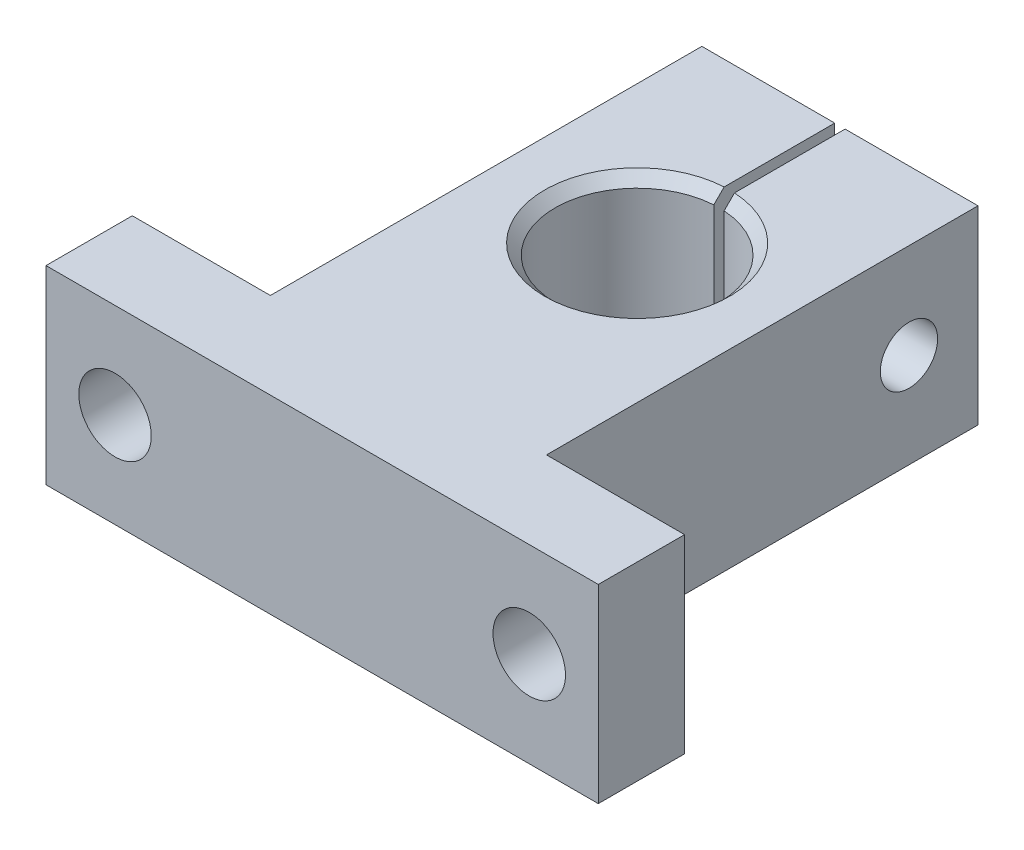
ISO-10303-21;
HEADER;
FILE_DESCRIPTION(('STEP AP214'),'2;1');
FILE_NAME('part.step','',(''),(''),'','','');
FILE_SCHEMA(('AUTOMOTIVE_DESIGN { 1 0 10303 214 1 1 1 1 }'));
ENDSEC;
DATA;
#1=APPLICATION_CONTEXT('core data for automotive mechanical design processes');
#2=APPLICATION_PROTOCOL_DEFINITION('international standard','automotive_design',2000,#1);
#3=PRODUCT_CONTEXT('',#1,'mechanical');
#4=PRODUCT('Part','Part','',(#3));
#5=PRODUCT_RELATED_PRODUCT_CATEGORY('part','',(#4));
#6=PRODUCT_DEFINITION_FORMATION('','',#4);
#7=PRODUCT_DEFINITION_CONTEXT('part definition',#1,'design');
#8=PRODUCT_DEFINITION('design','',#6,#7);
#9=PRODUCT_DEFINITION_SHAPE('','',#8);
#10=(LENGTH_UNIT() NAMED_UNIT(*) SI_UNIT(.MILLI.,.METRE.));
#11=(NAMED_UNIT(*) PLANE_ANGLE_UNIT() SI_UNIT($,.RADIAN.));
#12=(NAMED_UNIT(*) SI_UNIT($,.STERADIAN.) SOLID_ANGLE_UNIT());
#13=UNCERTAINTY_MEASURE_WITH_UNIT(LENGTH_MEASURE(1.E-05),#10,'distance_accuracy_value','');
#14=(GEOMETRIC_REPRESENTATION_CONTEXT(3) GLOBAL_UNCERTAINTY_ASSIGNED_CONTEXT((#13)) GLOBAL_UNIT_ASSIGNED_CONTEXT((#10,
#11,#12)) REPRESENTATION_CONTEXT('',''));
#15=CARTESIAN_POINT('',(0.,0.,0.));
#16=DIRECTION('',(0.,0.,1.));
#17=DIRECTION('',(1.,0.,0.));
#18=AXIS2_PLACEMENT_3D('',#15,#16,#17);
#19=CARTESIAN_POINT('',(20.32,13.97,23.1775));
#20=DIRECTION('',(0.,0.,-1.));
#21=DIRECTION('',(-1.,0.,0.));
#22=AXIS2_PLACEMENT_3D('',#19,#20,#21);
#23=PLANE('',#22);
#24=CARTESIAN_POINT('',(15.24,6.985,23.1775));
#25=DIRECTION('',(0.,0.,-1.));
#26=DIRECTION('',(-1.,0.,0.));
#27=AXIS2_PLACEMENT_3D('',#24,#25,#26);
#28=CIRCLE('',#27,2.667);
#29=CARTESIAN_POINT('',(12.573,6.985,23.1775));
#30=VERTEX_POINT('',#29);
#31=EDGE_CURVE('E337',#30,#30,#28,.T.);
#32=ORIENTED_EDGE('',*,*,#31,.T.);
#33=EDGE_LOOP('',(#32));
#34=FACE_BOUND('',#33,.T.);
#35=CARTESIAN_POINT('',(-15.24,6.985,23.1775));
#36=DIRECTION('',(0.,0.,-1.));
#37=DIRECTION('',(-1.,0.,0.));
#38=AXIS2_PLACEMENT_3D('',#35,#36,#37);
#39=CIRCLE('',#38,2.667);
#40=CARTESIAN_POINT('',(-17.907,6.985,23.1775));
#41=VERTEX_POINT('',#40);
#42=EDGE_CURVE('E431',#41,#41,#39,.T.);
#43=ORIENTED_EDGE('',*,*,#42,.T.);
#44=EDGE_LOOP('',(#43));
#45=FACE_BOUND('',#44,.T.);
#46=DIRECTION('',(1.,0.,0.));
#47=VECTOR('',#46,1.);
#48=CARTESIAN_POINT('',(20.32,0.,23.1775));
#49=LINE('',#48,#47);
#50=CARTESIAN_POINT('',(-20.32,0.,23.1775));
#51=VERTEX_POINT('',#50);
#52=CARTESIAN_POINT('',(20.32,0.,23.1775));
#53=VERTEX_POINT('',#52);
#54=EDGE_CURVE('E164',#51,#53,#49,.T.);
#55=ORIENTED_EDGE('',*,*,#54,.T.);
#56=DIRECTION('',(0.,-1.,0.));
#57=VECTOR('',#56,1.);
#58=CARTESIAN_POINT('',(20.32,13.97,23.1775));
#59=LINE('',#58,#57);
#60=CARTESIAN_POINT('',(20.32,13.97,23.1775));
#61=VERTEX_POINT('',#60);
#62=EDGE_CURVE('E145',#61,#53,#59,.T.);
#63=ORIENTED_EDGE('',*,*,#62,.F.);
#64=DIRECTION('',(1.,0.,0.));
#65=VECTOR('',#64,1.);
#66=CARTESIAN_POINT('',(20.32,13.97,23.1775));
#67=LINE('',#66,#65);
#68=CARTESIAN_POINT('',(-20.32,13.97,23.1775));
#69=VERTEX_POINT('',#68);
#70=EDGE_CURVE('E152',#69,#61,#67,.T.);
#71=ORIENTED_EDGE('',*,*,#70,.F.);
#72=DIRECTION('',(0.,-1.,0.));
#73=VECTOR('',#72,1.);
#74=CARTESIAN_POINT('',(-20.32,13.97,23.1775));
#75=LINE('',#74,#73);
#76=EDGE_CURVE('E297',#69,#51,#75,.T.);
#77=ORIENTED_EDGE('',*,*,#76,.T.);
#78=EDGE_LOOP('',(#55,#63,#71,#77));
#79=FACE_BOUND('',#78,.T.);
#80=ADVANCED_FACE('F35',(#34,#45,#79),#23,.F.);
#81=CARTESIAN_POINT('',(20.32,13.97,16.8275));
#82=DIRECTION('',(-1.,0.,0.));
#83=DIRECTION('',(0.,0.,1.));
#84=AXIS2_PLACEMENT_3D('',#81,#82,#83);
#85=PLANE('',#84);
#86=DIRECTION('',(0.,0.,-1.));
#87=VECTOR('',#86,1.);
#88=CARTESIAN_POINT('',(20.32,0.,16.8275));
#89=LINE('',#88,#87);
#90=CARTESIAN_POINT('',(20.32,0.,16.8275));
#91=VERTEX_POINT('',#90);
#92=EDGE_CURVE('E336',#53,#91,#89,.T.);
#93=ORIENTED_EDGE('',*,*,#92,.T.);
#94=DIRECTION('',(0.,-1.,0.));
#95=VECTOR('',#94,1.);
#96=CARTESIAN_POINT('',(20.32,13.97,16.8275));
#97=LINE('',#96,#95);
#98=CARTESIAN_POINT('',(20.32,13.97,16.8275));
#99=VERTEX_POINT('',#98);
#100=EDGE_CURVE('E148',#99,#91,#97,.T.);
#101=ORIENTED_EDGE('',*,*,#100,.F.);
#102=DIRECTION('',(0.,0.,-1.));
#103=VECTOR('',#102,1.);
#104=CARTESIAN_POINT('',(20.32,13.97,16.8275));
#105=LINE('',#104,#103);
#106=EDGE_CURVE('E141',#61,#99,#105,.T.);
#107=ORIENTED_EDGE('',*,*,#106,.F.);
#108=ORIENTED_EDGE('',*,*,#62,.T.);
#109=EDGE_LOOP('',(#93,#101,#107,#108));
#110=FACE_BOUND('',#109,.T.);
#111=ADVANCED_FACE('F143',(#110),#85,.F.);
#112=CARTESIAN_POINT('',(10.16,13.97,16.8275));
#113=DIRECTION('',(0.,0.,1.));
#114=DIRECTION('',(1.,0.,0.));
#115=AXIS2_PLACEMENT_3D('',#112,#113,#114);
#116=PLANE('',#115);
#117=CARTESIAN_POINT('',(15.24,6.985,16.8275));
#118=DIRECTION('',(0.,0.,1.));
#119=DIRECTION('',(1.,0.,0.));
#120=AXIS2_PLACEMENT_3D('',#117,#118,#119);
#121=CIRCLE('',#120,3.42900000000002);
#122=CARTESIAN_POINT('',(18.669,6.985,16.8275));
#123=VERTEX_POINT('',#122);
#124=EDGE_CURVE('E374',#123,#123,#121,.T.);
#125=ORIENTED_EDGE('',*,*,#124,.T.);
#126=EDGE_LOOP('',(#125));
#127=FACE_BOUND('',#126,.T.);
#128=DIRECTION('',(-1.,0.,0.));
#129=VECTOR('',#128,1.);
#130=CARTESIAN_POINT('',(10.16,0.,16.8275));
#131=LINE('',#130,#129);
#132=CARTESIAN_POINT('',(10.16,0.,16.8275));
#133=VERTEX_POINT('',#132);
#134=EDGE_CURVE('E275',#91,#133,#131,.T.);
#135=ORIENTED_EDGE('',*,*,#134,.T.);
#136=DIRECTION('',(0.,-1.,0.));
#137=VECTOR('',#136,1.);
#138=CARTESIAN_POINT('',(10.16,13.97,16.8275));
#139=LINE('',#138,#137);
#140=CARTESIAN_POINT('',(10.16,13.97,16.8275));
#141=VERTEX_POINT('',#140);
#142=EDGE_CURVE('E169',#141,#133,#139,.T.);
#143=ORIENTED_EDGE('',*,*,#142,.F.);
#144=DIRECTION('',(-1.,0.,0.));
#145=VECTOR('',#144,1.);
#146=CARTESIAN_POINT('',(10.16,13.97,16.8275));
#147=LINE('',#146,#145);
#148=EDGE_CURVE('E151',#99,#141,#147,.T.);
#149=ORIENTED_EDGE('',*,*,#148,.F.);
#150=ORIENTED_EDGE('',*,*,#100,.T.);
#151=EDGE_LOOP('',(#135,#143,#149,#150));
#152=FACE_BOUND('',#151,.T.);
#153=ADVANCED_FACE('F249',(#127,#152),#116,.F.);
#154=CARTESIAN_POINT('',(10.16,13.97,-14.9225));
#155=DIRECTION('',(-1.,0.,0.));
#156=DIRECTION('',(0.,0.,1.));
#157=AXIS2_PLACEMENT_3D('',#154,#155,#156);
#158=PLANE('',#157);
#159=CARTESIAN_POINT('',(10.16,6.985,-9.8425));
#160=DIRECTION('',(-1.,0.,0.));
#161=DIRECTION('',(0.,0.,1.));
#162=AXIS2_PLACEMENT_3D('',#159,#160,#161);
#163=CIRCLE('',#162,2.1082);
#164=CARTESIAN_POINT('',(10.16,6.985,-7.7343));
#165=VERTEX_POINT('',#164);
#166=EDGE_CURVE('E262',#165,#165,#163,.T.);
#167=ORIENTED_EDGE('',*,*,#166,.T.);
#168=EDGE_LOOP('',(#167));
#169=FACE_BOUND('',#168,.T.);
#170=DIRECTION('',(0.,0.,-1.));
#171=VECTOR('',#170,1.);
#172=CARTESIAN_POINT('',(10.16,0.,-14.9225));
#173=LINE('',#172,#171);
#174=CARTESIAN_POINT('',(10.16,0.,-14.9225));
#175=VERTEX_POINT('',#174);
#176=EDGE_CURVE('E266',#133,#175,#173,.T.);
#177=ORIENTED_EDGE('',*,*,#176,.T.);
#178=DIRECTION('',(0.,-1.,0.));
#179=VECTOR('',#178,1.);
#180=CARTESIAN_POINT('',(10.16,13.97,-14.9225));
#181=LINE('',#180,#179);
#182=CARTESIAN_POINT('',(10.16,13.97,-14.9225));
#183=VERTEX_POINT('',#182);
#184=EDGE_CURVE('E269',#183,#175,#181,.T.);
#185=ORIENTED_EDGE('',*,*,#184,.F.);
#186=DIRECTION('',(0.,0.,-1.));
#187=VECTOR('',#186,1.);
#188=CARTESIAN_POINT('',(10.16,13.97,-14.9225));
#189=LINE('',#188,#187);
#190=EDGE_CURVE('E325',#141,#183,#189,.T.);
#191=ORIENTED_EDGE('',*,*,#190,.F.);
#192=ORIENTED_EDGE('',*,*,#142,.T.);
#193=EDGE_LOOP('',(#177,#185,#191,#192));
#194=FACE_BOUND('',#193,.T.);
#195=ADVANCED_FACE('F251',(#169,#194),#158,.F.);
#196=CARTESIAN_POINT('',(10.16,13.97,-14.9225));
#197=DIRECTION('',(0.,0.,1.));
#198=DIRECTION('',(1.,0.,0.));
#199=AXIS2_PLACEMENT_3D('',#196,#197,#198);
#200=PLANE('',#199);
#201=DIRECTION('',(-1.,0.,0.));
#202=VECTOR('',#201,1.);
#203=CARTESIAN_POINT('',(10.16,0.,-14.9225));
#204=LINE('',#203,#202);
#205=CARTESIAN_POINT('',(0.381,0.,-14.9225));
#206=VERTEX_POINT('',#205);
#207=EDGE_CURVE('E274',#175,#206,#204,.T.);
#208=ORIENTED_EDGE('',*,*,#207,.T.);
#209=DIRECTION('',(0.,-1.,0.));
#210=VECTOR('',#209,1.);
#211=CARTESIAN_POINT('',(0.381,13.97,-14.9225));
#212=LINE('',#211,#210);
#213=CARTESIAN_POINT('',(0.381,13.97,-14.9225));
#214=VERTEX_POINT('',#213);
#215=EDGE_CURVE('E280',#214,#206,#212,.T.);
#216=ORIENTED_EDGE('',*,*,#215,.F.);
#217=DIRECTION('',(-1.,0.,0.));
#218=VECTOR('',#217,1.);
#219=CARTESIAN_POINT('',(10.16,13.97,-14.9225));
#220=LINE('',#219,#218);
#221=EDGE_CURVE('E279',#183,#214,#220,.T.);
#222=ORIENTED_EDGE('',*,*,#221,.F.);
#223=ORIENTED_EDGE('',*,*,#184,.T.);
#224=EDGE_LOOP('',(#208,#216,#222,#223));
#225=FACE_BOUND('',#224,.T.);
#226=ADVANCED_FACE('F216',(#225),#200,.F.);
#227=CARTESIAN_POINT('',(0.381,13.97,-6.0204563988123));
#228=DIRECTION('',(1.,0.,0.));
#229=DIRECTION('',(0.,0.,-1.));
#230=AXIS2_PLACEMENT_3D('',#227,#228,#229);
#231=PLANE('',#230);
#232=CARTESIAN_POINT('',(0.380999999999999,6.985,-9.8425));
#233=DIRECTION('',(1.,0.,0.));
#234=DIRECTION('',(0.,0.,-1.));
#235=AXIS2_PLACEMENT_3D('',#232,#233,#234);
#236=CIRCLE('',#235,2.1082);
#237=CARTESIAN_POINT('',(0.380999999999999,6.985,-11.9507));
#238=VERTEX_POINT('',#237);
#239=EDGE_CURVE('E175',#238,#238,#236,.T.);
#240=ORIENTED_EDGE('',*,*,#239,.T.);
#241=EDGE_LOOP('',(#240));
#242=FACE_BOUND('',#241,.T.);
#243=DIRECTION('',(0.,0.,1.));
#244=VECTOR('',#243,1.);
#245=CARTESIAN_POINT('',(0.381,0.,-6.0204563988123));
#246=LINE('',#245,#244);
#247=CARTESIAN_POINT('',(0.381,0.,-6.78380934652502));
#248=VERTEX_POINT('',#247);
#249=EDGE_CURVE('E283',#206,#248,#246,.T.);
#250=ORIENTED_EDGE('',*,*,#249,.T.);
#251=CARTESIAN_POINT('',(0.381,0.,-6.78380934652502));
#252=CARTESIAN_POINT('',(0.381,0.127013431177008,-6.65659726265353));
#253=CARTESIAN_POINT('',(0.381,0.254020146755004,-6.52937847508559));
#254=CARTESIAN_POINT('',(0.381,0.508020146755014,-6.27492749251469));
#255=CARTESIAN_POINT('',(0.381,0.635013431177024,-6.14769529751172));
#256=CARTESIAN_POINT('',(0.381,0.762000000000018,-6.0204563988123));
#257=B_SPLINE_CURVE_WITH_KNOTS('',3,(#251,#252,#253,#254,#255,#256),.UNSPECIFIED.,.F.,.F.,(4,2,
4),(0.,0.539293919314413,1.07858783880735),.UNSPECIFIED.);
#258=CARTESIAN_POINT('',(0.381,0.762000000000018,-6.0204563988123));
#259=VERTEX_POINT('',#258);
#260=EDGE_CURVE('E226',#248,#259,#257,.T.);
#261=ORIENTED_EDGE('',*,*,#260,.T.);
#262=DIRECTION('',(0.,-1.,0.));
#263=VECTOR('',#262,1.);
#264=CARTESIAN_POINT('',(0.381,13.97,-6.0204563988123));
#265=LINE('',#264,#263);
#266=CARTESIAN_POINT('',(0.381,13.208,-6.0204563988123));
#267=VERTEX_POINT('',#266);
#268=EDGE_CURVE('E314',#267,#259,#265,.T.);
#269=ORIENTED_EDGE('',*,*,#268,.F.);
#270=CARTESIAN_POINT('',(0.381,13.208,-6.0204563988123));
#271=CARTESIAN_POINT('',(0.381,13.334986568823,-6.14769529751172));
#272=CARTESIAN_POINT('',(0.381,13.461979853245,-6.27492749251468));
#273=CARTESIAN_POINT('',(0.381,13.715979853245,-6.52937847508558));
#274=CARTESIAN_POINT('',(0.381,13.842986568823,-6.65659726265352));
#275=CARTESIAN_POINT('',(0.381,13.97,-6.78380934652501));
#276=B_SPLINE_CURVE_WITH_KNOTS('',3,(#270,#271,#272,#273,#274,#275),.UNSPECIFIED.,.F.,.F.,(4,2,
4),(0.,0.539293919492934,1.07858783880734),.UNSPECIFIED.);
#277=CARTESIAN_POINT('',(0.381,13.97,-6.78380934652501));
#278=VERTEX_POINT('',#277);
#279=EDGE_CURVE('E51',#267,#278,#276,.T.);
#280=ORIENTED_EDGE('',*,*,#279,.T.);
#281=DIRECTION('',(0.,0.,1.));
#282=VECTOR('',#281,1.);
#283=CARTESIAN_POINT('',(0.381,13.97,-6.0204563988123));
#284=LINE('',#283,#282);
#285=EDGE_CURVE('E318',#214,#278,#284,.T.);
#286=ORIENTED_EDGE('',*,*,#285,.F.);
#287=ORIENTED_EDGE('',*,*,#215,.T.);
#288=EDGE_LOOP('',(#250,#261,#269,#280,#286,#287));
#289=FACE_BOUND('',#288,.T.);
#290=ADVANCED_FACE('F211',(#242,#289),#231,.F.);
#291=CARTESIAN_POINT('',(0.,13.97,0.));
#292=DIRECTION('',(0.,-1.,0.));
#293=DIRECTION('',(0.,0.,-1.));
#294=AXIS2_PLACEMENT_3D('',#291,#292,#293);
#295=CYLINDRICAL_SURFACE('',#294,6.0325);
#296=ORIENTED_EDGE('',*,*,#268,.T.);
#297=CARTESIAN_POINT('',(0.,0.762000000000018,0.));
#298=DIRECTION('',(0.,1.,0.));
#299=DIRECTION('',(0.,0.,1.));
#300=AXIS2_PLACEMENT_3D('',#297,#298,#299);
#301=CIRCLE('',#300,6.0325);
#302=CARTESIAN_POINT('',(-0.380999999999997,0.762000000000018,-6.0204563988123));
#303=VERTEX_POINT('',#302);
#304=EDGE_CURVE('E167',#259,#303,#301,.F.);
#305=ORIENTED_EDGE('',*,*,#304,.T.);
#306=DIRECTION('',(0.,-1.,0.));
#307=VECTOR('',#306,1.);
#308=CARTESIAN_POINT('',(-0.380999999999997,13.97,-6.0204563988123));
#309=LINE('',#308,#307);
#310=CARTESIAN_POINT('',(-0.380999999999997,13.208,-6.0204563988123));
#311=VERTEX_POINT('',#310);
#312=EDGE_CURVE('E311',#311,#303,#309,.T.);
#313=ORIENTED_EDGE('',*,*,#312,.F.);
#314=CARTESIAN_POINT('',(0.,13.208,0.));
#315=DIRECTION('',(0.,1.,0.));
#316=DIRECTION('',(0.,0.,1.));
#317=AXIS2_PLACEMENT_3D('',#314,#315,#316);
#318=CIRCLE('',#317,6.0325);
#319=EDGE_CURVE('E165',#311,#267,#318,.T.);
#320=ORIENTED_EDGE('',*,*,#319,.T.);
#321=EDGE_LOOP('',(#296,#305,#313,#320));
#322=FACE_BOUND('',#321,.T.);
#323=ADVANCED_FACE('F205',(#322),#295,.F.);
#324=CARTESIAN_POINT('',(-0.381,13.97,-6.0204563988123));
#325=DIRECTION('',(-1.,0.,0.));
#326=DIRECTION('',(0.,0.,1.));
#327=AXIS2_PLACEMENT_3D('',#324,#325,#326);
#328=PLANE('',#327);
#329=CARTESIAN_POINT('',(-0.380999999999999,6.985,-9.8425));
#330=DIRECTION('',(-1.,0.,0.));
#331=DIRECTION('',(0.,0.,1.));
#332=AXIS2_PLACEMENT_3D('',#329,#330,#331);
#333=CIRCLE('',#332,2.1082);
#334=CARTESIAN_POINT('',(-0.380999999999999,6.985,-7.7343));
#335=VERTEX_POINT('',#334);
#336=EDGE_CURVE('E173',#335,#335,#333,.T.);
#337=ORIENTED_EDGE('',*,*,#336,.T.);
#338=EDGE_LOOP('',(#337));
#339=FACE_BOUND('',#338,.T.);
#340=ORIENTED_EDGE('',*,*,#312,.T.);
#341=CARTESIAN_POINT('',(-0.380999999999997,0.762000000000018,-6.0204563988123));
#342=CARTESIAN_POINT('',(-0.380999999999999,0.635013431177024,-6.14769529751172));
#343=CARTESIAN_POINT('',(-0.381,0.508020146755014,-6.27492749251469));
#344=CARTESIAN_POINT('',(-0.381,0.254020146755004,-6.52937847508559));
#345=CARTESIAN_POINT('',(-0.381,0.127013431177008,-6.65659726265353));
#346=CARTESIAN_POINT('',(-0.381,0.,-6.78380934652502));
#347=B_SPLINE_CURVE_WITH_KNOTS('',3,(#341,#342,#343,#344,#345,#346),.UNSPECIFIED.,.F.,.F.,(4,2,
4),(0.,0.539293919492942,1.07858783880735),.UNSPECIFIED.);
#348=CARTESIAN_POINT('',(-0.381,0.,-6.78380934652502));
#349=VERTEX_POINT('',#348);
#350=EDGE_CURVE('E188',#303,#349,#347,.T.);
#351=ORIENTED_EDGE('',*,*,#350,.T.);
#352=DIRECTION('',(0.,0.,-1.));
#353=VECTOR('',#352,1.);
#354=CARTESIAN_POINT('',(-0.381,0.,-6.0204563988123));
#355=LINE('',#354,#353);
#356=CARTESIAN_POINT('',(-0.381,0.,-14.9225));
#357=VERTEX_POINT('',#356);
#358=EDGE_CURVE('E285',#349,#357,#355,.T.);
#359=ORIENTED_EDGE('',*,*,#358,.T.);
#360=DIRECTION('',(0.,-1.,0.));
#361=VECTOR('',#360,1.);
#362=CARTESIAN_POINT('',(-0.381,13.97,-14.9225));
#363=LINE('',#362,#361);
#364=CARTESIAN_POINT('',(-0.381,13.97,-14.9225));
#365=VERTEX_POINT('',#364);
#366=EDGE_CURVE('E308',#365,#357,#363,.T.);
#367=ORIENTED_EDGE('',*,*,#366,.F.);
#368=DIRECTION('',(0.,0.,-1.));
#369=VECTOR('',#368,1.);
#370=CARTESIAN_POINT('',(-0.381,13.97,-6.0204563988123));
#371=LINE('',#370,#369);
#372=CARTESIAN_POINT('',(-0.381,13.97,-6.78380934652501));
#373=VERTEX_POINT('',#372);
#374=EDGE_CURVE('E321',#373,#365,#371,.T.);
#375=ORIENTED_EDGE('',*,*,#374,.F.);
#376=CARTESIAN_POINT('',(-0.381,13.97,-6.78380934652501));
#377=CARTESIAN_POINT('',(-0.381,13.842986568823,-6.65659726265352));
#378=CARTESIAN_POINT('',(-0.381,13.715979853245,-6.52937847508558));
#379=CARTESIAN_POINT('',(-0.381,13.461979853245,-6.27492749251468));
#380=CARTESIAN_POINT('',(-0.381,13.334986568823,-6.14769529751172));
#381=CARTESIAN_POINT('',(-0.381,13.208,-6.0204563988123));
#382=B_SPLINE_CURVE_WITH_KNOTS('',3,(#376,#377,#378,#379,#380,#381),.UNSPECIFIED.,.F.,.F.,(4,2,
4),(0.,0.539293919314404,1.07858783880734),.UNSPECIFIED.);
#383=EDGE_CURVE('E180',#373,#311,#382,.T.);
#384=ORIENTED_EDGE('',*,*,#383,.T.);
#385=EDGE_LOOP('',(#340,#351,#359,#367,#375,#384));
#386=FACE_BOUND('',#385,.T.);
#387=ADVANCED_FACE('F199',(#339,#386),#328,.F.);
#388=CARTESIAN_POINT('',(-0.381,13.97,-14.9225));
#389=DIRECTION('',(0.,0.,1.));
#390=DIRECTION('',(1.,0.,0.));
#391=AXIS2_PLACEMENT_3D('',#388,#389,#390);
#392=PLANE('',#391);
#393=DIRECTION('',(-1.,0.,0.));
#394=VECTOR('',#393,1.);
#395=CARTESIAN_POINT('',(-0.381,0.,-14.9225));
#396=LINE('',#395,#394);
#397=CARTESIAN_POINT('',(-10.16,0.,-14.9225));
#398=VERTEX_POINT('',#397);
#399=EDGE_CURVE('E290',#357,#398,#396,.T.);
#400=ORIENTED_EDGE('',*,*,#399,.T.);
#401=DIRECTION('',(0.,-1.,0.));
#402=VECTOR('',#401,1.);
#403=CARTESIAN_POINT('',(-10.16,13.97,-14.9225));
#404=LINE('',#403,#402);
#405=CARTESIAN_POINT('',(-10.16,13.97,-14.9225));
#406=VERTEX_POINT('',#405);
#407=EDGE_CURVE('E305',#406,#398,#404,.T.);
#408=ORIENTED_EDGE('',*,*,#407,.F.);
#409=DIRECTION('',(-1.,0.,0.));
#410=VECTOR('',#409,1.);
#411=CARTESIAN_POINT('',(-0.381,13.97,-14.9225));
#412=LINE('',#411,#410);
#413=EDGE_CURVE('E323',#365,#406,#412,.T.);
#414=ORIENTED_EDGE('',*,*,#413,.F.);
#415=ORIENTED_EDGE('',*,*,#366,.T.);
#416=EDGE_LOOP('',(#400,#408,#414,#415));
#417=FACE_BOUND('',#416,.T.);
#418=ADVANCED_FACE('F204',(#417),#392,.F.);
#419=CARTESIAN_POINT('',(-10.16,13.97,-14.9225));
#420=DIRECTION('',(1.,0.,0.));
#421=DIRECTION('',(0.,0.,-1.));
#422=AXIS2_PLACEMENT_3D('',#419,#420,#421);
#423=PLANE('',#422);
#424=CARTESIAN_POINT('',(-10.16,6.985,-9.8425));
#425=DIRECTION('',(1.,0.,0.));
#426=DIRECTION('',(0.,0.,-1.));
#427=AXIS2_PLACEMENT_3D('',#424,#425,#426);
#428=CIRCLE('',#427,4.57200000000003);
#429=CARTESIAN_POINT('',(-10.16,6.985,-14.4145));
#430=VERTEX_POINT('',#429);
#431=EDGE_CURVE('E365',#430,#430,#428,.T.);
#432=ORIENTED_EDGE('',*,*,#431,.T.);
#433=EDGE_LOOP('',(#432));
#434=FACE_BOUND('',#433,.T.);
#435=DIRECTION('',(0.,0.,1.));
#436=VECTOR('',#435,1.);
#437=CARTESIAN_POINT('',(-10.16,0.,-14.9225));
#438=LINE('',#437,#436);
#439=CARTESIAN_POINT('',(-10.16,0.,16.8275));
#440=VERTEX_POINT('',#439);
#441=EDGE_CURVE('E292',#398,#440,#438,.T.);
#442=ORIENTED_EDGE('',*,*,#441,.T.);
#443=DIRECTION('',(0.,-1.,0.));
#444=VECTOR('',#443,1.);
#445=CARTESIAN_POINT('',(-10.16,13.97,16.8275));
#446=LINE('',#445,#444);
#447=CARTESIAN_POINT('',(-10.16,13.97,16.8275));
#448=VERTEX_POINT('',#447);
#449=EDGE_CURVE('E302',#448,#440,#446,.T.);
#450=ORIENTED_EDGE('',*,*,#449,.F.);
#451=DIRECTION('',(0.,0.,1.));
#452=VECTOR('',#451,1.);
#453=CARTESIAN_POINT('',(-10.16,13.97,-14.9225));
#454=LINE('',#453,#452);
#455=EDGE_CURVE('E330',#406,#448,#454,.T.);
#456=ORIENTED_EDGE('',*,*,#455,.F.);
#457=ORIENTED_EDGE('',*,*,#407,.T.);
#458=EDGE_LOOP('',(#442,#450,#456,#457));
#459=FACE_BOUND('',#458,.T.);
#460=ADVANCED_FACE('F351',(#434,#459),#423,.F.);
#461=CARTESIAN_POINT('',(-20.32,13.97,16.8275));
#462=DIRECTION('',(0.,0.,1.));
#463=DIRECTION('',(1.,0.,0.));
#464=AXIS2_PLACEMENT_3D('',#461,#462,#463);
#465=PLANE('',#464);
#466=CARTESIAN_POINT('',(-15.24,6.985,16.8275));
#467=DIRECTION('',(0.,0.,1.));
#468=DIRECTION('',(1.,0.,0.));
#469=AXIS2_PLACEMENT_3D('',#466,#467,#468);
#470=CIRCLE('',#469,3.42900000000001);
#471=CARTESIAN_POINT('',(-11.811,6.985,16.8275));
#472=VERTEX_POINT('',#471);
#473=EDGE_CURVE('E11',#472,#472,#470,.T.);
#474=ORIENTED_EDGE('',*,*,#473,.T.);
#475=EDGE_LOOP('',(#474));
#476=FACE_BOUND('',#475,.T.);
#477=DIRECTION('',(-1.,0.,0.));
#478=VECTOR('',#477,1.);
#479=CARTESIAN_POINT('',(-20.32,0.,16.8275));
#480=LINE('',#479,#478);
#481=CARTESIAN_POINT('',(-20.32,0.,16.8275));
#482=VERTEX_POINT('',#481);
#483=EDGE_CURVE('E294',#440,#482,#480,.T.);
#484=ORIENTED_EDGE('',*,*,#483,.T.);
#485=DIRECTION('',(0.,-1.,0.));
#486=VECTOR('',#485,1.);
#487=CARTESIAN_POINT('',(-20.32,13.97,16.8275));
#488=LINE('',#487,#486);
#489=CARTESIAN_POINT('',(-20.32,13.97,16.8275));
#490=VERTEX_POINT('',#489);
#491=EDGE_CURVE('E299',#490,#482,#488,.T.);
#492=ORIENTED_EDGE('',*,*,#491,.F.);
#493=DIRECTION('',(-1.,0.,0.));
#494=VECTOR('',#493,1.);
#495=CARTESIAN_POINT('',(-20.32,13.97,16.8275));
#496=LINE('',#495,#494);
#497=EDGE_CURVE('E332',#448,#490,#496,.T.);
#498=ORIENTED_EDGE('',*,*,#497,.F.);
#499=ORIENTED_EDGE('',*,*,#449,.T.);
#500=EDGE_LOOP('',(#484,#492,#498,#499));
#501=FACE_BOUND('',#500,.T.);
#502=ADVANCED_FACE('F347',(#476,#501),#465,.F.);
#503=CARTESIAN_POINT('',(-20.32,13.97,23.1775));
#504=DIRECTION('',(1.,0.,0.));
#505=DIRECTION('',(0.,0.,-1.));
#506=AXIS2_PLACEMENT_3D('',#503,#504,#505);
#507=PLANE('',#506);
#508=DIRECTION('',(0.,0.,1.));
#509=VECTOR('',#508,1.);
#510=CARTESIAN_POINT('',(-20.32,0.,23.1775));
#511=LINE('',#510,#509);
#512=EDGE_CURVE('E161',#482,#51,#511,.T.);
#513=ORIENTED_EDGE('',*,*,#512,.T.);
#514=ORIENTED_EDGE('',*,*,#76,.F.);
#515=DIRECTION('',(0.,0.,1.));
#516=VECTOR('',#515,1.);
#517=CARTESIAN_POINT('',(-20.32,13.97,23.1775));
#518=LINE('',#517,#516);
#519=EDGE_CURVE('E157',#490,#69,#518,.T.);
#520=ORIENTED_EDGE('',*,*,#519,.F.);
#521=ORIENTED_EDGE('',*,*,#491,.T.);
#522=EDGE_LOOP('',(#513,#514,#520,#521));
#523=FACE_BOUND('',#522,.T.);
#524=ADVANCED_FACE('F343',(#523),#507,.F.);
#525=CARTESIAN_POINT('',(0.,13.97,0.));
#526=DIRECTION('',(0.,1.,0.));
#527=DIRECTION('',(0.,0.,1.));
#528=AXIS2_PLACEMENT_3D('',#525,#526,#527);
#529=PLANE('',#528);
#530=ORIENTED_EDGE('',*,*,#285,.T.);
#531=CARTESIAN_POINT('',(0.,13.97,0.));
#532=DIRECTION('',(0.,1.,0.));
#533=DIRECTION('',(0.,0.,1.));
#534=AXIS2_PLACEMENT_3D('',#531,#532,#533);
#535=CIRCLE('',#534,6.7945);
#536=EDGE_CURVE('E232',#278,#373,#535,.F.);
#537=ORIENTED_EDGE('',*,*,#536,.T.);
#538=ORIENTED_EDGE('',*,*,#374,.T.);
#539=ORIENTED_EDGE('',*,*,#413,.T.);
#540=ORIENTED_EDGE('',*,*,#455,.T.);
#541=ORIENTED_EDGE('',*,*,#497,.T.);
#542=ORIENTED_EDGE('',*,*,#519,.T.);
#543=ORIENTED_EDGE('',*,*,#70,.T.);
#544=ORIENTED_EDGE('',*,*,#106,.T.);
#545=ORIENTED_EDGE('',*,*,#148,.T.);
#546=ORIENTED_EDGE('',*,*,#190,.T.);
#547=ORIENTED_EDGE('',*,*,#221,.T.);
#548=EDGE_LOOP('',(#530,#537,#538,#539,#540,#541,#542,#543,#544,#545,#546,#547));
#549=FACE_BOUND('',#548,.T.);
#550=ADVANCED_FACE('F155',(#549),#529,.T.);
#551=CARTESIAN_POINT('',(0.,0.,0.));
#552=DIRECTION('',(0.,1.,0.));
#553=DIRECTION('',(0.,0.,1.));
#554=AXIS2_PLACEMENT_3D('',#551,#552,#553);
#555=PLANE('',#554);
#556=ORIENTED_EDGE('',*,*,#358,.F.);
#557=CARTESIAN_POINT('',(0.,0.,0.));
#558=DIRECTION('',(0.,1.,0.));
#559=DIRECTION('',(0.,0.,1.));
#560=AXIS2_PLACEMENT_3D('',#557,#558,#559);
#561=CIRCLE('',#560,6.79450000000002);
#562=EDGE_CURVE('E59',#349,#248,#561,.T.);
#563=ORIENTED_EDGE('',*,*,#562,.T.);
#564=ORIENTED_EDGE('',*,*,#249,.F.);
#565=ORIENTED_EDGE('',*,*,#207,.F.);
#566=ORIENTED_EDGE('',*,*,#176,.F.);
#567=ORIENTED_EDGE('',*,*,#134,.F.);
#568=ORIENTED_EDGE('',*,*,#92,.F.);
#569=ORIENTED_EDGE('',*,*,#54,.F.);
#570=ORIENTED_EDGE('',*,*,#512,.F.);
#571=ORIENTED_EDGE('',*,*,#483,.F.);
#572=ORIENTED_EDGE('',*,*,#441,.F.);
#573=ORIENTED_EDGE('',*,*,#399,.F.);
#574=EDGE_LOOP('',(#556,#563,#564,#565,#566,#567,#568,#569,#570,#571,#572,#573));
#575=FACE_BOUND('',#574,.T.);
#576=ADVANCED_FACE('F282',(#575),#555,.F.);
#577=CARTESIAN_POINT('',(-15.24,6.985,30.7975));
#578=DIRECTION('',(0.,0.,-1.));
#579=DIRECTION('',(-1.,0.,0.));
#580=AXIS2_PLACEMENT_3D('',#577,#578,#579);
#581=CYLINDRICAL_SURFACE('',#580,2.667);
#582=CARTESIAN_POINT('',(-15.24,6.985,17.5895));
#583=DIRECTION('',(0.,0.,1.));
#584=DIRECTION('',(1.,0.,0.));
#585=AXIS2_PLACEMENT_3D('',#582,#583,#584);
#586=CIRCLE('',#585,2.667);
#587=CARTESIAN_POINT('',(-12.573,6.985,17.5895));
#588=VERTEX_POINT('',#587);
#589=EDGE_CURVE('E44',#588,#588,#586,.F.);
#590=ORIENTED_EDGE('',*,*,#589,.T.);
#591=EDGE_LOOP('',(#590));
#592=FACE_BOUND('',#591,.T.);
#593=ORIENTED_EDGE('',*,*,#42,.F.);
#594=EDGE_LOOP('',(#593));
#595=FACE_BOUND('',#594,.T.);
#596=ADVANCED_FACE('F379',(#592,#595),#581,.F.);
#597=CARTESIAN_POINT('',(15.24,6.985,30.7975));
#598=DIRECTION('',(0.,0.,-1.));
#599=DIRECTION('',(-1.,0.,0.));
#600=AXIS2_PLACEMENT_3D('',#597,#598,#599);
#601=CYLINDRICAL_SURFACE('',#600,2.667);
#602=CARTESIAN_POINT('',(15.24,6.985,17.5895));
#603=DIRECTION('',(0.,0.,1.));
#604=DIRECTION('',(1.,0.,0.));
#605=AXIS2_PLACEMENT_3D('',#602,#603,#604);
#606=CIRCLE('',#605,2.667);
#607=CARTESIAN_POINT('',(17.907,6.985,17.5895));
#608=VERTEX_POINT('',#607);
#609=EDGE_CURVE('E369',#608,#608,#606,.F.);
#610=ORIENTED_EDGE('',*,*,#609,.T.);
#611=EDGE_LOOP('',(#610));
#612=FACE_BOUND('',#611,.T.);
#613=ORIENTED_EDGE('',*,*,#31,.F.);
#614=EDGE_LOOP('',(#613));
#615=FACE_BOUND('',#614,.T.);
#616=ADVANCED_FACE('F407',(#612,#615),#601,.F.);
#617=CARTESIAN_POINT('',(-5.334,6.985,-9.8425));
#618=DIRECTION('',(-1.,0.,0.));
#619=DIRECTION('',(0.,0.,1.));
#620=AXIS2_PLACEMENT_3D('',#617,#618,#619);
#621=CYLINDRICAL_SURFACE('',#620,3.81);
#622=CARTESIAN_POINT('',(-9.39799999999998,6.985,-9.8425));
#623=DIRECTION('',(1.,0.,0.));
#624=DIRECTION('',(0.,0.,-1.));
#625=AXIS2_PLACEMENT_3D('',#622,#623,#624);
#626=CIRCLE('',#625,3.81);
#627=CARTESIAN_POINT('',(-9.39799999999998,6.985,-6.0325));
#628=VERTEX_POINT('',#627);
#629=EDGE_CURVE('E363',#628,#628,#626,.F.);
#630=CARTESIAN_POINT('',(-5.334,6.985,-9.8425));
#631=DIRECTION('',(-1.,0.,0.));
#632=DIRECTION('',(0.,0.,1.));
#633=AXIS2_PLACEMENT_3D('',#630,#631,#632);
#634=CIRCLE('',#633,3.81);
#635=CARTESIAN_POINT('',(-5.334,6.985,-6.0325));
#636=VERTEX_POINT('',#635);
#637=EDGE_CURVE('E428',#636,#636,#634,.T.);
#638=CARTESIAN_POINT('',(-9.39799999999998,6.985,-6.0325));
#639=CARTESIAN_POINT('',(-9.35566666666665,6.985,-6.0325));
#640=CARTESIAN_POINT('',(-9.31333333333331,6.985,-6.0325));
#641=CARTESIAN_POINT('',(-9.22866666666665,6.985,-6.0325));
#642=CARTESIAN_POINT('',(-9.18633333333332,6.985,-6.0325));
#643=CARTESIAN_POINT('',(-9.10166666666665,6.985,-6.0325));
#644=CARTESIAN_POINT('',(-9.05933333333332,6.985,-6.0325));
#645=CARTESIAN_POINT('',(-8.97466666666665,6.985,-6.0325));
#646=CARTESIAN_POINT('',(-8.93233333333332,6.985,-6.0325));
#647=CARTESIAN_POINT('',(-8.84766666666665,6.985,-6.0325));
#648=CARTESIAN_POINT('',(-8.80533333333332,6.985,-6.0325));
#649=CARTESIAN_POINT('',(-8.72066666666665,6.985,-6.0325));
#650=CARTESIAN_POINT('',(-8.67833333333332,6.985,-6.0325));
#651=CARTESIAN_POINT('',(-8.59366666666665,6.985,-6.0325));
#652=CARTESIAN_POINT('',(-8.55133333333332,6.985,-6.0325));
#653=CARTESIAN_POINT('',(-8.46666666666665,6.985,-6.0325));
#654=CARTESIAN_POINT('',(-8.42433333333332,6.985,-6.0325));
#655=CARTESIAN_POINT('',(-8.33966666666665,6.985,-6.0325));
#656=CARTESIAN_POINT('',(-8.29733333333332,6.985,-6.0325));
#657=CARTESIAN_POINT('',(-8.21266666666665,6.985,-6.0325));
#658=CARTESIAN_POINT('',(-8.17033333333332,6.985,-6.0325));
#659=CARTESIAN_POINT('',(-8.08566666666665,6.985,-6.0325));
#660=CARTESIAN_POINT('',(-8.04333333333332,6.985,-6.0325));
#661=CARTESIAN_POINT('',(-7.95866666666665,6.985,-6.0325));
#662=CARTESIAN_POINT('',(-7.91633333333332,6.985,-6.0325));
#663=CARTESIAN_POINT('',(-7.83166666666666,6.985,-6.0325));
#664=CARTESIAN_POINT('',(-7.78933333333332,6.985,-6.0325));
#665=CARTESIAN_POINT('',(-7.70466666666666,6.985,-6.0325));
#666=CARTESIAN_POINT('',(-7.66233333333332,6.985,-6.0325));
#667=CARTESIAN_POINT('',(-7.57766666666666,6.985,-6.0325));
#668=CARTESIAN_POINT('',(-7.53533333333332,6.985,-6.0325));
#669=CARTESIAN_POINT('',(-7.45066666666666,6.985,-6.0325));
#670=CARTESIAN_POINT('',(-7.40833333333332,6.985,-6.0325));
#671=CARTESIAN_POINT('',(-7.32366666666666,6.985,-6.0325));
#672=CARTESIAN_POINT('',(-7.28133333333332,6.985,-6.0325));
#673=CARTESIAN_POINT('',(-7.19666666666666,6.985,-6.0325));
#674=CARTESIAN_POINT('',(-7.15433333333332,6.985,-6.0325));
#675=CARTESIAN_POINT('',(-7.06966666666666,6.985,-6.0325));
#676=CARTESIAN_POINT('',(-7.02733333333333,6.985,-6.0325));
#677=CARTESIAN_POINT('',(-6.94266666666666,6.985,-6.0325));
#678=CARTESIAN_POINT('',(-6.90033333333333,6.985,-6.0325));
#679=CARTESIAN_POINT('',(-6.81566666666666,6.985,-6.0325));
#680=CARTESIAN_POINT('',(-6.77333333333333,6.985,-6.0325));
#681=CARTESIAN_POINT('',(-6.68866666666666,6.985,-6.0325));
#682=CARTESIAN_POINT('',(-6.64633333333333,6.985,-6.0325));
#683=CARTESIAN_POINT('',(-6.56166666666666,6.985,-6.0325));
#684=CARTESIAN_POINT('',(-6.51933333333333,6.985,-6.0325));
#685=CARTESIAN_POINT('',(-6.43466666666666,6.985,-6.0325));
#686=CARTESIAN_POINT('',(-6.39233333333333,6.985,-6.0325));
#687=CARTESIAN_POINT('',(-6.30766666666666,6.985,-6.0325));
#688=CARTESIAN_POINT('',(-6.26533333333333,6.985,-6.0325));
#689=CARTESIAN_POINT('',(-6.18066666666666,6.985,-6.0325));
#690=CARTESIAN_POINT('',(-6.13833333333333,6.985,-6.0325));
#691=CARTESIAN_POINT('',(-6.05366666666666,6.985,-6.0325));
#692=CARTESIAN_POINT('',(-6.01133333333333,6.985,-6.0325));
#693=CARTESIAN_POINT('',(-5.92666666666666,6.985,-6.0325));
#694=CARTESIAN_POINT('',(-5.88433333333333,6.985,-6.0325));
#695=CARTESIAN_POINT('',(-5.79966666666666,6.985,-6.0325));
#696=CARTESIAN_POINT('',(-5.75733333333333,6.985,-6.0325));
#697=CARTESIAN_POINT('',(-5.67266666666666,6.985,-6.0325));
#698=CARTESIAN_POINT('',(-5.63033333333333,6.985,-6.0325));
#699=CARTESIAN_POINT('',(-5.54566666666666,6.985,-6.0325));
#700=CARTESIAN_POINT('',(-5.50333333333333,6.985,-6.0325));
#701=CARTESIAN_POINT('',(-5.41866666666666,6.985,-6.0325));
#702=CARTESIAN_POINT('',(-5.37633333333333,6.985,-6.0325));
#703=CARTESIAN_POINT('',(-5.334,6.985,-6.0325));
#704=B_SPLINE_CURVE_WITH_KNOTS('',3,(#638,#639,#640,#641,#642,#643,#644,#645,#646,#647,#648,
#649,#650,#651,#652,#653,#654,#655,#656,#657,#658,#659,#660,#661,#662,#663,#664,#665,#666,#667,
#668,#669,#670,#671,#672,#673,#674,#675,#676,#677,#678,#679,#680,#681,#682,#683,#684,#685,#686,
#687,#688,#689,#690,#691,#692,#693,#694,#695,#696,#697,#698,#699,#700,#701,#702,#703),
.UNSPECIFIED.,.F.,.F.,(4,2,2,2,2,2,2,2,2,2,2,2,2,2,2,2,2,2,2,2,2,2,2,2,2,2,2,2,2,2,2,2,4),(0.,
0.127,0.253999999999999,0.380999999999998,0.507999999999998,0.634999999999997,0.761999999999997,
0.888999999999996,1.01599999999999,1.14299999999999,1.27,1.39699999999999,1.52399999999999,
1.65099999999999,1.77799999999999,1.90499999999999,2.03199999999999,2.15899999999999,
2.28599999999999,2.41299999999999,2.53999999999999,2.66699999999999,2.79399999999999,
2.92099999999999,3.04799999999999,3.17499999999999,3.30199999999999,3.42899999999999,
3.55599999999998,3.68299999999998,3.80999999999998,3.93699999999998,4.06399999999998),.UNSPECIFIED.);
#705=EDGE_CURVE('BSEAM410',#628,#636,#704,.T.);
#706=ORIENTED_EDGE('',*,*,#629,.T.);
#707=ORIENTED_EDGE('',*,*,#637,.F.);
#708=ORIENTED_EDGE('',*,*,#705,.T.);
#709=ORIENTED_EDGE('',*,*,#705,.F.);
#710=EDGE_LOOP('',(#706,#708,#707,#709));
#711=FACE_BOUND('',#710,.T.);
#712=ADVANCED_FACE('F410',(#711),#621,.F.);
#713=CARTESIAN_POINT('',(-5.334,6.985,-9.8425));
#714=DIRECTION('',(-1.,0.,0.));
#715=DIRECTION('',(0.,0.,1.));
#716=AXIS2_PLACEMENT_3D('',#713,#714,#715);
#717=PLANE('',#716);
#718=CARTESIAN_POINT('',(-5.334,6.985,-9.8425));
#719=DIRECTION('',(-1.,0.,0.));
#720=DIRECTION('',(0.,0.,1.));
#721=AXIS2_PLACEMENT_3D('',#718,#719,#720);
#722=CIRCLE('',#721,2.1082);
#723=CARTESIAN_POINT('',(-5.334,6.985,-7.7343));
#724=VERTEX_POINT('',#723);
#725=EDGE_CURVE('E176',#724,#724,#722,.T.);
#726=ORIENTED_EDGE('',*,*,#725,.F.);
#727=EDGE_LOOP('',(#726));
#728=FACE_BOUND('',#727,.T.);
#729=ORIENTED_EDGE('',*,*,#637,.T.);
#730=EDGE_LOOP('',(#729));
#731=FACE_BOUND('',#730,.T.);
#732=ADVANCED_FACE('F414',(#728,#731),#717,.T.);
#733=CARTESIAN_POINT('',(11.938,6.985,-9.8425));
#734=DIRECTION('',(-1.,0.,0.));
#735=DIRECTION('',(0.,0.,1.));
#736=AXIS2_PLACEMENT_3D('',#733,#734,#735);
#737=CYLINDRICAL_SURFACE('',#736,2.1082);
#738=ORIENTED_EDGE('',*,*,#725,.T.);
#739=EDGE_LOOP('',(#738));
#740=FACE_BOUND('',#739,.T.);
#741=ORIENTED_EDGE('',*,*,#336,.F.);
#742=EDGE_LOOP('',(#741));
#743=FACE_BOUND('',#742,.T.);
#744=ADVANCED_FACE('F417',(#740,#743),#737,.F.);
#745=ORIENTED_EDGE('',*,*,#239,.F.);
#746=EDGE_LOOP('',(#745));
#747=FACE_BOUND('',#746,.T.);
#748=ORIENTED_EDGE('',*,*,#166,.F.);
#749=EDGE_LOOP('',(#748));
#750=FACE_BOUND('',#749,.T.);
#751=ADVANCED_FACE('F241',(#747,#750),#737,.F.);
#752=CARTESIAN_POINT('',(0.,0.762000000000018,0.));
#753=DIRECTION('',(0.,-1.,0.));
#754=DIRECTION('',(0.,0.,-1.));
#755=AXIS2_PLACEMENT_3D('',#752,#753,#754);
#756=CONICAL_SURFACE('',#755,6.0325,0.785398163397448);
#757=ORIENTED_EDGE('',*,*,#260,.F.);
#758=ORIENTED_EDGE('',*,*,#562,.F.);
#759=ORIENTED_EDGE('',*,*,#350,.F.);
#760=ORIENTED_EDGE('',*,*,#304,.F.);
#761=EDGE_LOOP('',(#757,#758,#759,#760));
#762=FACE_BOUND('',#761,.T.);
#763=ADVANCED_FACE('F235',(#762),#756,.F.);
#764=CARTESIAN_POINT('',(0.,13.97,0.));
#765=DIRECTION('',(0.,1.,0.));
#766=DIRECTION('',(0.,0.,1.));
#767=AXIS2_PLACEMENT_3D('',#764,#765,#766);
#768=CONICAL_SURFACE('',#767,6.7945,0.785398163397444);
#769=ORIENTED_EDGE('',*,*,#279,.F.);
#770=ORIENTED_EDGE('',*,*,#319,.F.);
#771=ORIENTED_EDGE('',*,*,#383,.F.);
#772=ORIENTED_EDGE('',*,*,#536,.F.);
#773=EDGE_LOOP('',(#769,#770,#771,#772));
#774=FACE_BOUND('',#773,.T.);
#775=ADVANCED_FACE('F196',(#774),#768,.F.);
#776=CARTESIAN_POINT('',(-9.39799999999998,6.985,-9.8425));
#777=DIRECTION('',(-1.,0.,0.));
#778=DIRECTION('',(0.,0.,1.));
#779=AXIS2_PLACEMENT_3D('',#776,#777,#778);
#780=CONICAL_SURFACE('',#779,3.81,0.785398163397453);
#781=ORIENTED_EDGE('',*,*,#431,.F.);
#782=EDGE_LOOP('',(#781));
#783=FACE_BOUND('',#782,.T.);
#784=ORIENTED_EDGE('',*,*,#629,.F.);
#785=EDGE_LOOP('',(#784));
#786=FACE_BOUND('',#785,.T.);
#787=ADVANCED_FACE('F388',(#783,#786),#780,.F.);
#788=CARTESIAN_POINT('',(15.24,6.985,17.5895));
#789=DIRECTION('',(0.,0.,-1.));
#790=DIRECTION('',(-1.,0.,0.));
#791=AXIS2_PLACEMENT_3D('',#788,#789,#790);
#792=CONICAL_SURFACE('',#791,2.667,0.785398163397454);
#793=ORIENTED_EDGE('',*,*,#124,.F.);
#794=EDGE_LOOP('',(#793));
#795=FACE_BOUND('',#794,.T.);
#796=ORIENTED_EDGE('',*,*,#609,.F.);
#797=EDGE_LOOP('',(#796));
#798=FACE_BOUND('',#797,.T.);
#799=ADVANCED_FACE('F383',(#795,#798),#792,.F.);
#800=CARTESIAN_POINT('',(-15.24,6.985,17.5895));
#801=DIRECTION('',(0.,0.,-1.));
#802=DIRECTION('',(-1.,0.,0.));
#803=AXIS2_PLACEMENT_3D('',#800,#801,#802);
#804=CONICAL_SURFACE('',#803,2.667,0.785398163397451);
#805=ORIENTED_EDGE('',*,*,#473,.F.);
#806=EDGE_LOOP('',(#805));
#807=FACE_BOUND('',#806,.T.);
#808=ORIENTED_EDGE('',*,*,#589,.F.);
#809=EDGE_LOOP('',(#808));
#810=FACE_BOUND('',#809,.T.);
#811=ADVANCED_FACE('F38',(#807,#810),#804,.F.);
#812=CLOSED_SHELL('',(#80,#111,#153,#195,#226,#290,#323,#387,#418,#460,#502,#524,#550,#576,#596,
#616,#712,#732,#744,#751,#763,#775,#787,#799,#811));
#813=MANIFOLD_SOLID_BREP('B2',#812);
#814=ADVANCED_BREP_SHAPE_REPRESENTATION('',(#18,#813),#14);
#815=SHAPE_DEFINITION_REPRESENTATION(#9,#814);
ENDSEC;
END-ISO-10303-21;
